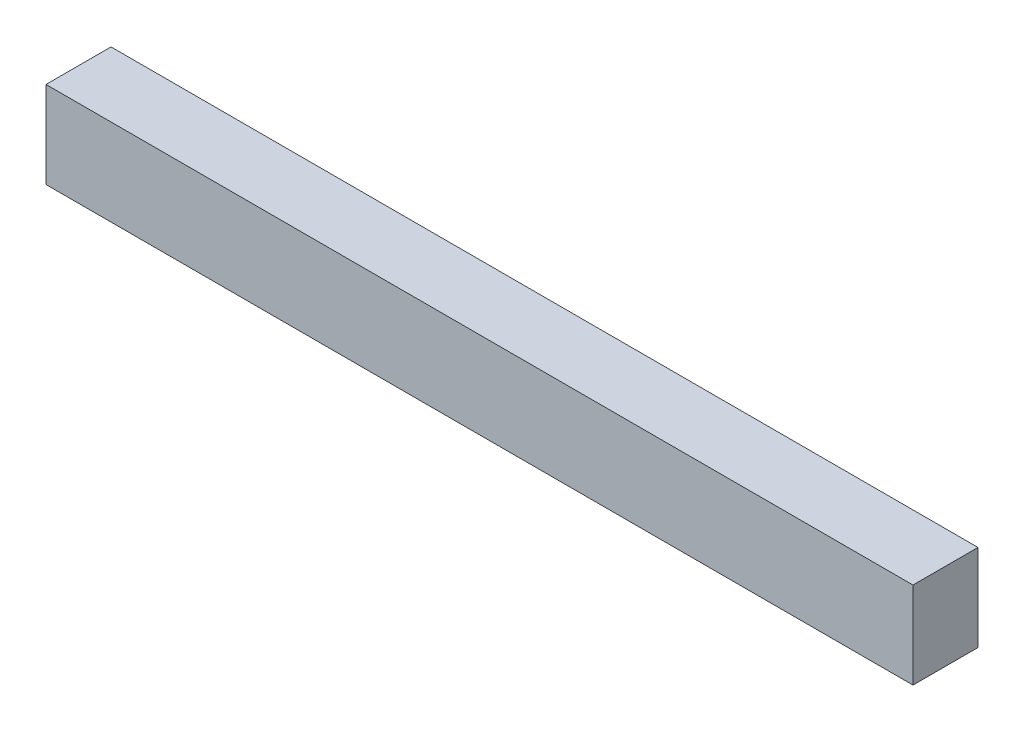
ISO-10303-21;
HEADER;
FILE_DESCRIPTION(('STEP AP214'),'2;1');
FILE_NAME('part.step','',(''),(''),'','','');
FILE_SCHEMA(('AUTOMOTIVE_DESIGN { 1 0 10303 214 1 1 1 1 }'));
ENDSEC;
DATA;
#1=APPLICATION_CONTEXT('core data for automotive mechanical design processes');
#2=APPLICATION_PROTOCOL_DEFINITION('international standard','automotive_design',2000,#1);
#3=PRODUCT_CONTEXT('',#1,'mechanical');
#4=PRODUCT('Part','Part','',(#3));
#5=PRODUCT_RELATED_PRODUCT_CATEGORY('part','',(#4));
#6=PRODUCT_DEFINITION_FORMATION('','',#4);
#7=PRODUCT_DEFINITION_CONTEXT('part definition',#1,'design');
#8=PRODUCT_DEFINITION('design','',#6,#7);
#9=PRODUCT_DEFINITION_SHAPE('','',#8);
#10=(LENGTH_UNIT() NAMED_UNIT(*) SI_UNIT(.MILLI.,.METRE.));
#11=(NAMED_UNIT(*) PLANE_ANGLE_UNIT() SI_UNIT($,.RADIAN.));
#12=(NAMED_UNIT(*) SI_UNIT($,.STERADIAN.) SOLID_ANGLE_UNIT());
#13=UNCERTAINTY_MEASURE_WITH_UNIT(LENGTH_MEASURE(1.E-05),#10,'distance_accuracy_value','');
#14=(GEOMETRIC_REPRESENTATION_CONTEXT(3) GLOBAL_UNCERTAINTY_ASSIGNED_CONTEXT((#13)) GLOBAL_UNIT_ASSIGNED_CONTEXT((#10,
#11,#12)) REPRESENTATION_CONTEXT('',''));
#15=CARTESIAN_POINT('',(0.,0.,0.));
#16=DIRECTION('',(0.,0.,1.));
#17=DIRECTION('',(1.,0.,0.));
#18=AXIS2_PLACEMENT_3D('',#15,#16,#17);
#19=CARTESIAN_POINT('',(400.,-469.409867616983,30.));
#20=DIRECTION('',(-1.,0.,0.));
#21=DIRECTION('',(0.,0.,1.));
#22=AXIS2_PLACEMENT_3D('',#19,#20,#21);
#23=PLANE('',#22);
#24=DIRECTION('',(0.,1.,0.));
#25=VECTOR('',#24,1.);
#26=CARTESIAN_POINT('',(400.,-469.409867616983,0.));
#27=LINE('',#26,#25);
#28=CARTESIAN_POINT('',(400.,-509.409867616983,0.));
#29=VERTEX_POINT('',#28);
#30=CARTESIAN_POINT('',(400.,-469.409867616983,0.));
#31=VERTEX_POINT('',#30);
#32=EDGE_CURVE('E100',#29,#31,#27,.T.);
#33=ORIENTED_EDGE('',*,*,#32,.T.);
#34=DIRECTION('',(0.,0.,-1.));
#35=VECTOR('',#34,1.);
#36=CARTESIAN_POINT('',(400.,-469.409867616983,30.));
#37=LINE('',#36,#35);
#38=CARTESIAN_POINT('',(400.,-469.409867616983,30.));
#39=VERTEX_POINT('',#38);
#40=EDGE_CURVE('E11',#39,#31,#37,.T.);
#41=ORIENTED_EDGE('',*,*,#40,.F.);
#42=DIRECTION('',(0.,1.,0.));
#43=VECTOR('',#42,1.);
#44=CARTESIAN_POINT('',(400.,-469.409867616983,30.));
#45=LINE('',#44,#43);
#46=CARTESIAN_POINT('',(400.,-509.409867616983,30.));
#47=VERTEX_POINT('',#46);
#48=EDGE_CURVE('E88',#47,#39,#45,.T.);
#49=ORIENTED_EDGE('',*,*,#48,.F.);
#50=DIRECTION('',(0.,0.,-1.));
#51=VECTOR('',#50,1.);
#52=CARTESIAN_POINT('',(400.,-509.409867616983,30.));
#53=LINE('',#52,#51);
#54=EDGE_CURVE('E96',#47,#29,#53,.T.);
#55=ORIENTED_EDGE('',*,*,#54,.T.);
#56=EDGE_LOOP('',(#33,#41,#49,#55));
#57=FACE_BOUND('',#56,.T.);
#58=ADVANCED_FACE('F37',(#57),#23,.F.);
#59=CARTESIAN_POINT('',(400.,-469.409867616983,30.));
#60=DIRECTION('',(0.,-1.,0.));
#61=DIRECTION('',(0.,0.,-1.));
#62=AXIS2_PLACEMENT_3D('',#59,#60,#61);
#63=PLANE('',#62);
#64=DIRECTION('',(-1.,0.,0.));
#65=VECTOR('',#64,1.);
#66=CARTESIAN_POINT('',(400.,-469.409867616983,0.));
#67=LINE('',#66,#65);
#68=CARTESIAN_POINT('',(0.,-469.409867616983,0.));
#69=VERTEX_POINT('',#68);
#70=EDGE_CURVE('E92',#31,#69,#67,.T.);
#71=ORIENTED_EDGE('',*,*,#70,.T.);
#72=DIRECTION('',(0.,0.,-1.));
#73=VECTOR('',#72,1.);
#74=CARTESIAN_POINT('',(0.,-469.409867616983,30.));
#75=LINE('',#74,#73);
#76=CARTESIAN_POINT('',(0.,-469.409867616983,30.));
#77=VERTEX_POINT('',#76);
#78=EDGE_CURVE('E45',#77,#69,#75,.T.);
#79=ORIENTED_EDGE('',*,*,#78,.F.);
#80=DIRECTION('',(-1.,0.,0.));
#81=VECTOR('',#80,1.);
#82=CARTESIAN_POINT('',(400.,-469.409867616983,30.));
#83=LINE('',#82,#81);
#84=EDGE_CURVE('E83',#39,#77,#83,.T.);
#85=ORIENTED_EDGE('',*,*,#84,.F.);
#86=ORIENTED_EDGE('',*,*,#40,.T.);
#87=EDGE_LOOP('',(#71,#79,#85,#86));
#88=FACE_BOUND('',#87,.T.);
#89=ADVANCED_FACE('F91',(#88),#63,.F.);
#90=CARTESIAN_POINT('',(0.,-469.409867616983,30.));
#91=DIRECTION('',(1.,0.,0.));
#92=DIRECTION('',(0.,0.,-1.));
#93=AXIS2_PLACEMENT_3D('',#90,#91,#92);
#94=PLANE('',#93);
#95=DIRECTION('',(0.,-1.,0.));
#96=VECTOR('',#95,1.);
#97=CARTESIAN_POINT('',(0.,-469.409867616983,0.));
#98=LINE('',#97,#96);
#99=CARTESIAN_POINT('',(0.,-509.409867616983,0.));
#100=VERTEX_POINT('',#99);
#101=EDGE_CURVE('E70',#69,#100,#98,.T.);
#102=ORIENTED_EDGE('',*,*,#101,.T.);
#103=DIRECTION('',(0.,0.,-1.));
#104=VECTOR('',#103,1.);
#105=CARTESIAN_POINT('',(0.,-509.409867616983,30.));
#106=LINE('',#105,#104);
#107=CARTESIAN_POINT('',(0.,-509.409867616983,30.));
#108=VERTEX_POINT('',#107);
#109=EDGE_CURVE('E93',#108,#100,#106,.T.);
#110=ORIENTED_EDGE('',*,*,#109,.F.);
#111=DIRECTION('',(0.,-1.,0.));
#112=VECTOR('',#111,1.);
#113=CARTESIAN_POINT('',(0.,-469.409867616983,30.));
#114=LINE('',#113,#112);
#115=EDGE_CURVE('E86',#77,#108,#114,.T.);
#116=ORIENTED_EDGE('',*,*,#115,.F.);
#117=ORIENTED_EDGE('',*,*,#78,.T.);
#118=EDGE_LOOP('',(#102,#110,#116,#117));
#119=FACE_BOUND('',#118,.T.);
#120=ADVANCED_FACE('F94',(#119),#94,.F.);
#121=CARTESIAN_POINT('',(400.,-509.409867616983,30.));
#122=DIRECTION('',(0.,1.,0.));
#123=DIRECTION('',(0.,0.,1.));
#124=AXIS2_PLACEMENT_3D('',#121,#122,#123);
#125=PLANE('',#124);
#126=DIRECTION('',(1.,0.,0.));
#127=VECTOR('',#126,1.);
#128=CARTESIAN_POINT('',(400.,-509.409867616983,0.));
#129=LINE('',#128,#127);
#130=EDGE_CURVE('E76',#100,#29,#129,.T.);
#131=ORIENTED_EDGE('',*,*,#130,.T.);
#132=ORIENTED_EDGE('',*,*,#54,.F.);
#133=DIRECTION('',(1.,0.,0.));
#134=VECTOR('',#133,1.);
#135=CARTESIAN_POINT('',(400.,-509.409867616983,30.));
#136=LINE('',#135,#134);
#137=EDGE_CURVE('E53',#108,#47,#136,.T.);
#138=ORIENTED_EDGE('',*,*,#137,.F.);
#139=ORIENTED_EDGE('',*,*,#109,.T.);
#140=EDGE_LOOP('',(#131,#132,#138,#139));
#141=FACE_BOUND('',#140,.T.);
#142=ADVANCED_FACE('F107',(#141),#125,.F.);
#143=CARTESIAN_POINT('',(0.,0.,30.));
#144=DIRECTION('',(0.,0.,-1.));
#145=DIRECTION('',(-1.,0.,0.));
#146=AXIS2_PLACEMENT_3D('',#143,#144,#145);
#147=PLANE('',#146);
#148=ORIENTED_EDGE('',*,*,#48,.T.);
#149=ORIENTED_EDGE('',*,*,#84,.T.);
#150=ORIENTED_EDGE('',*,*,#115,.T.);
#151=ORIENTED_EDGE('',*,*,#137,.T.);
#152=EDGE_LOOP('',(#148,#149,#150,#151));
#153=FACE_BOUND('',#152,.T.);
#154=ADVANCED_FACE('F84',(#153),#147,.F.);
#155=CARTESIAN_POINT('',(0.,0.,0.));
#156=DIRECTION('',(0.,0.,-1.));
#157=DIRECTION('',(-1.,0.,0.));
#158=AXIS2_PLACEMENT_3D('',#155,#156,#157);
#159=PLANE('',#158);
#160=ORIENTED_EDGE('',*,*,#32,.F.);
#161=ORIENTED_EDGE('',*,*,#130,.F.);
#162=ORIENTED_EDGE('',*,*,#101,.F.);
#163=ORIENTED_EDGE('',*,*,#70,.F.);
#164=EDGE_LOOP('',(#160,#161,#162,#163));
#165=FACE_BOUND('',#164,.T.);
#166=ADVANCED_FACE('F110',(#165),#159,.T.);
#167=CLOSED_SHELL('',(#58,#89,#120,#142,#154,#166));
#168=MANIFOLD_SOLID_BREP('B2',#167);
#169=ADVANCED_BREP_SHAPE_REPRESENTATION('',(#18,#168),#14);
#170=SHAPE_DEFINITION_REPRESENTATION(#9,#169);
ENDSEC;
END-ISO-10303-21;
